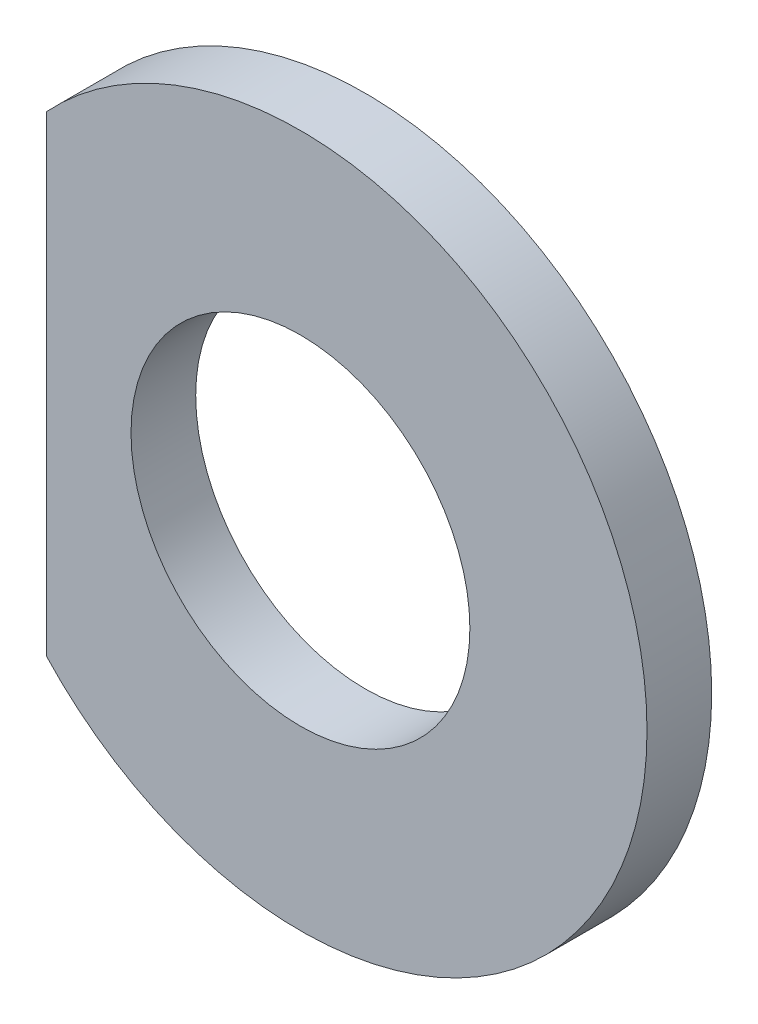
ISO-10303-21;
HEADER;
FILE_DESCRIPTION(('STEP AP214'),'2;1');
FILE_NAME('part.step','',(''),(''),'','','');
FILE_SCHEMA(('AUTOMOTIVE_DESIGN { 1 0 10303 214 1 1 1 1 }'));
ENDSEC;
DATA;
#1=APPLICATION_CONTEXT('core data for automotive mechanical design processes');
#2=APPLICATION_PROTOCOL_DEFINITION('international standard','automotive_design',2000,#1);
#3=PRODUCT_CONTEXT('',#1,'mechanical');
#4=PRODUCT('Part','Part','',(#3));
#5=PRODUCT_RELATED_PRODUCT_CATEGORY('part','',(#4));
#6=PRODUCT_DEFINITION_FORMATION('','',#4);
#7=PRODUCT_DEFINITION_CONTEXT('part definition',#1,'design');
#8=PRODUCT_DEFINITION('design','',#6,#7);
#9=PRODUCT_DEFINITION_SHAPE('','',#8);
#10=(LENGTH_UNIT() NAMED_UNIT(*) SI_UNIT(.MILLI.,.METRE.));
#11=(NAMED_UNIT(*) PLANE_ANGLE_UNIT() SI_UNIT($,.RADIAN.));
#12=(NAMED_UNIT(*) SI_UNIT($,.STERADIAN.) SOLID_ANGLE_UNIT());
#13=UNCERTAINTY_MEASURE_WITH_UNIT(LENGTH_MEASURE(1.E-05),#10,'distance_accuracy_value','');
#14=(GEOMETRIC_REPRESENTATION_CONTEXT(3) GLOBAL_UNCERTAINTY_ASSIGNED_CONTEXT((#13)) GLOBAL_UNIT_ASSIGNED_CONTEXT((#10,
#11,#12)) REPRESENTATION_CONTEXT('',''));
#15=CARTESIAN_POINT('',(0.,0.,0.));
#16=DIRECTION('',(0.,0.,1.));
#17=DIRECTION('',(1.,0.,0.));
#18=AXIS2_PLACEMENT_3D('',#15,#16,#17);
#19=CARTESIAN_POINT('',(0.,0.,-0.42));
#20=DIRECTION('',(0.,0.,1.));
#21=DIRECTION('',(1.,0.,0.));
#22=AXIS2_PLACEMENT_3D('',#19,#20,#21);
#23=CYLINDRICAL_SURFACE('',#22,2.25);
#24=CARTESIAN_POINT('',(0.,0.,0.));
#25=DIRECTION('',(0.,0.,1.));
#26=DIRECTION('',(1.,0.,0.));
#27=AXIS2_PLACEMENT_3D('',#24,#25,#26);
#28=CIRCLE('',#27,2.25);
#29=CARTESIAN_POINT('',(-1.65,-1.52970585407784,0.));
#30=VERTEX_POINT('',#29);
#31=CARTESIAN_POINT('',(-1.65,1.52970585407784,0.));
#32=VERTEX_POINT('',#31);
#33=EDGE_CURVE('E61',#30,#32,#28,.T.);
#34=ORIENTED_EDGE('',*,*,#33,.F.);
#35=DIRECTION('',(0.,0.,1.));
#36=VECTOR('',#35,1.);
#37=CARTESIAN_POINT('',(-1.65,-1.52970585407784,-0.42));
#38=LINE('',#37,#36);
#39=CARTESIAN_POINT('',(-1.65,-1.52970585407784,-0.42));
#40=VERTEX_POINT('',#39);
#41=EDGE_CURVE('E11',#40,#30,#38,.T.);
#42=ORIENTED_EDGE('',*,*,#41,.F.);
#43=CARTESIAN_POINT('',(0.,0.,-0.42));
#44=DIRECTION('',(0.,0.,1.));
#45=DIRECTION('',(1.,0.,0.));
#46=AXIS2_PLACEMENT_3D('',#43,#44,#45);
#47=CIRCLE('',#46,2.25);
#48=CARTESIAN_POINT('',(-1.65,1.52970585407784,-0.42));
#49=VERTEX_POINT('',#48);
#50=EDGE_CURVE('E66',#40,#49,#47,.T.);
#51=ORIENTED_EDGE('',*,*,#50,.T.);
#52=DIRECTION('',(0.,0.,1.));
#53=VECTOR('',#52,1.);
#54=CARTESIAN_POINT('',(-1.65,1.52970585407784,-0.42));
#55=LINE('',#54,#53);
#56=EDGE_CURVE('E35',#49,#32,#55,.T.);
#57=ORIENTED_EDGE('',*,*,#56,.T.);
#58=EDGE_LOOP('',(#34,#42,#51,#57));
#59=FACE_BOUND('',#58,.T.);
#60=ADVANCED_FACE('F32',(#59),#23,.T.);
#61=CARTESIAN_POINT('',(-1.65,1.52970585407784,-0.42));
#62=DIRECTION('',(-1.,0.,0.));
#63=DIRECTION('',(0.,0.,1.));
#64=AXIS2_PLACEMENT_3D('',#61,#62,#63);
#65=PLANE('',#64);
#66=DIRECTION('',(0.,-1.,0.));
#67=VECTOR('',#66,1.);
#68=CARTESIAN_POINT('',(-1.65,1.52970585407784,0.));
#69=LINE('',#68,#67);
#70=EDGE_CURVE('E58',#32,#30,#69,.T.);
#71=ORIENTED_EDGE('',*,*,#70,.F.);
#72=ORIENTED_EDGE('',*,*,#56,.F.);
#73=DIRECTION('',(0.,-1.,0.));
#74=VECTOR('',#73,1.);
#75=CARTESIAN_POINT('',(-1.65,1.52970585407784,-0.42));
#76=LINE('',#75,#74);
#77=EDGE_CURVE('E60',#49,#40,#76,.T.);
#78=ORIENTED_EDGE('',*,*,#77,.T.);
#79=ORIENTED_EDGE('',*,*,#41,.T.);
#80=EDGE_LOOP('',(#71,#72,#78,#79));
#81=FACE_BOUND('',#80,.T.);
#82=ADVANCED_FACE('F56',(#81),#65,.T.);
#83=CARTESIAN_POINT('',(0.,0.,-0.42));
#84=DIRECTION('',(0.,0.,1.));
#85=DIRECTION('',(1.,0.,0.));
#86=AXIS2_PLACEMENT_3D('',#83,#84,#85);
#87=PLANE('',#86);
#88=CARTESIAN_POINT('',(0.,0.,-0.42));
#89=DIRECTION('',(0.,0.,1.));
#90=DIRECTION('',(1.,0.,0.));
#91=AXIS2_PLACEMENT_3D('',#88,#89,#90);
#92=CIRCLE('',#91,1.1);
#93=CARTESIAN_POINT('',(1.1,0.,-0.42));
#94=VERTEX_POINT('',#93);
#95=EDGE_CURVE('E63',#94,#94,#92,.T.);
#96=ORIENTED_EDGE('',*,*,#95,.T.);
#97=EDGE_LOOP('',(#96));
#98=FACE_BOUND('',#97,.T.);
#99=ORIENTED_EDGE('',*,*,#50,.F.);
#100=ORIENTED_EDGE('',*,*,#77,.F.);
#101=EDGE_LOOP('',(#99,#100));
#102=FACE_BOUND('',#101,.T.);
#103=ADVANCED_FACE('F77',(#98,#102),#87,.F.);
#104=CARTESIAN_POINT('',(0.,0.,0.));
#105=DIRECTION('',(0.,0.,1.));
#106=DIRECTION('',(1.,0.,0.));
#107=AXIS2_PLACEMENT_3D('',#104,#105,#106);
#108=PLANE('',#107);
#109=CARTESIAN_POINT('',(0.,0.,0.));
#110=DIRECTION('',(0.,0.,1.));
#111=DIRECTION('',(1.,0.,0.));
#112=AXIS2_PLACEMENT_3D('',#109,#110,#111);
#113=CIRCLE('',#112,1.1);
#114=CARTESIAN_POINT('',(1.1,0.,0.));
#115=VERTEX_POINT('',#114);
#116=EDGE_CURVE('E71',#115,#115,#113,.T.);
#117=ORIENTED_EDGE('',*,*,#116,.F.);
#118=EDGE_LOOP('',(#117));
#119=FACE_BOUND('',#118,.T.);
#120=ORIENTED_EDGE('',*,*,#33,.T.);
#121=ORIENTED_EDGE('',*,*,#70,.T.);
#122=EDGE_LOOP('',(#120,#121));
#123=FACE_BOUND('',#122,.T.);
#124=ADVANCED_FACE('F65',(#119,#123),#108,.T.);
#125=CARTESIAN_POINT('',(0.,0.,-0.42));
#126=DIRECTION('',(0.,0.,1.));
#127=DIRECTION('',(1.,0.,0.));
#128=AXIS2_PLACEMENT_3D('',#125,#126,#127);
#129=CYLINDRICAL_SURFACE('',#128,1.1);
#130=ORIENTED_EDGE('',*,*,#95,.F.);
#131=EDGE_LOOP('',(#130));
#132=FACE_BOUND('',#131,.T.);
#133=ORIENTED_EDGE('',*,*,#116,.T.);
#134=EDGE_LOOP('',(#133));
#135=FACE_BOUND('',#134,.T.);
#136=ADVANCED_FACE('F80',(#132,#135),#129,.F.);
#137=CLOSED_SHELL('',(#60,#82,#103,#124,#136));
#138=MANIFOLD_SOLID_BREP('B2',#137);
#139=ADVANCED_BREP_SHAPE_REPRESENTATION('',(#18,#138),#14);
#140=SHAPE_DEFINITION_REPRESENTATION(#9,#139);
ENDSEC;
END-ISO-10303-21;
